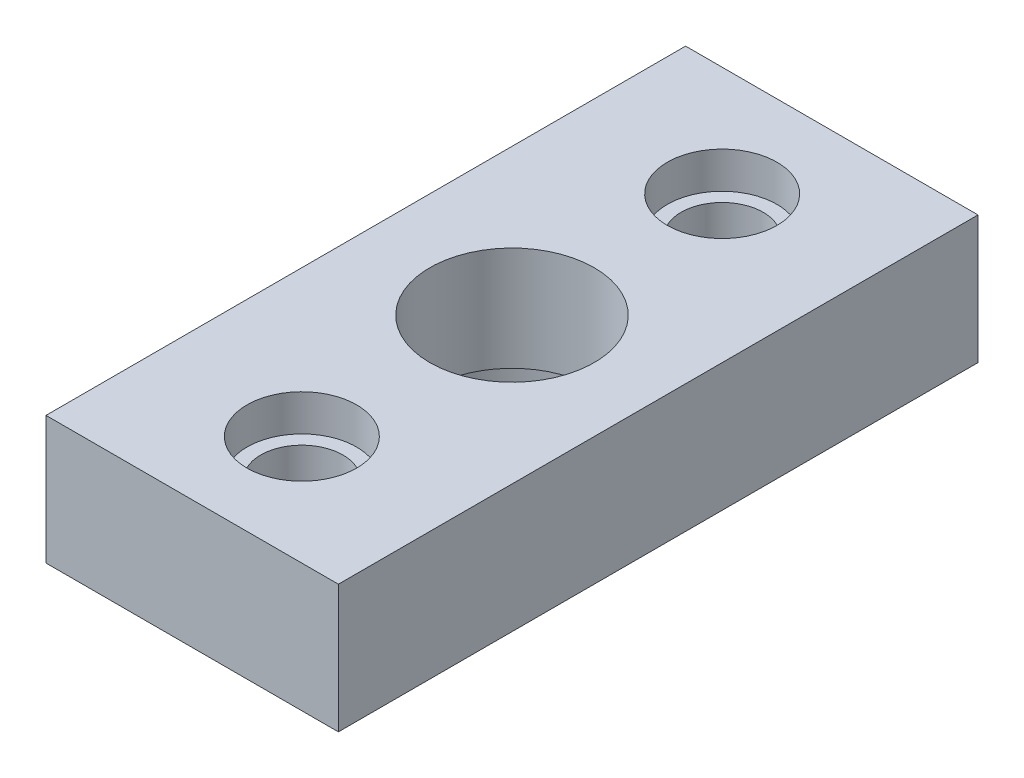
ISO-10303-21;
HEADER;
FILE_DESCRIPTION(('STEP AP214'),'2;1');
FILE_NAME('part.step','',(''),(''),'','','');
FILE_SCHEMA(('AUTOMOTIVE_DESIGN { 1 0 10303 214 1 1 1 1 }'));
ENDSEC;
DATA;
#1=APPLICATION_CONTEXT('core data for automotive mechanical design processes');
#2=APPLICATION_PROTOCOL_DEFINITION('international standard','automotive_design',2000,#1);
#3=PRODUCT_CONTEXT('',#1,'mechanical');
#4=PRODUCT('Part','Part','',(#3));
#5=PRODUCT_RELATED_PRODUCT_CATEGORY('part','',(#4));
#6=PRODUCT_DEFINITION_FORMATION('','',#4);
#7=PRODUCT_DEFINITION_CONTEXT('part definition',#1,'design');
#8=PRODUCT_DEFINITION('design','',#6,#7);
#9=PRODUCT_DEFINITION_SHAPE('','',#8);
#10=(LENGTH_UNIT() NAMED_UNIT(*) SI_UNIT(.MILLI.,.METRE.));
#11=(NAMED_UNIT(*) PLANE_ANGLE_UNIT() SI_UNIT($,.RADIAN.));
#12=(NAMED_UNIT(*) SI_UNIT($,.STERADIAN.) SOLID_ANGLE_UNIT());
#13=UNCERTAINTY_MEASURE_WITH_UNIT(LENGTH_MEASURE(1.E-05),#10,'distance_accuracy_value','');
#14=(GEOMETRIC_REPRESENTATION_CONTEXT(3) GLOBAL_UNCERTAINTY_ASSIGNED_CONTEXT((#13)) GLOBAL_UNIT_ASSIGNED_CONTEXT((#10,
#11,#12)) REPRESENTATION_CONTEXT('',''));
#15=CARTESIAN_POINT('',(0.,0.,0.));
#16=DIRECTION('',(0.,0.,1.));
#17=DIRECTION('',(1.,0.,0.));
#18=AXIS2_PLACEMENT_3D('',#15,#16,#17);
#19=CARTESIAN_POINT('',(8.,7.,17.5));
#20=DIRECTION('',(-1.,0.,0.));
#21=DIRECTION('',(0.,0.,1.));
#22=AXIS2_PLACEMENT_3D('',#19,#20,#21);
#23=PLANE('',#22);
#24=DIRECTION('',(0.,0.,-1.));
#25=VECTOR('',#24,1.);
#26=CARTESIAN_POINT('',(8.,0.,17.5));
#27=LINE('',#26,#25);
#28=CARTESIAN_POINT('',(8.,0.,17.5));
#29=VERTEX_POINT('',#28);
#30=CARTESIAN_POINT('',(8.,0.,-17.5));
#31=VERTEX_POINT('',#30);
#32=EDGE_CURVE('E96',#29,#31,#27,.T.);
#33=ORIENTED_EDGE('',*,*,#32,.T.);
#34=DIRECTION('',(0.,-1.,0.));
#35=VECTOR('',#34,1.);
#36=CARTESIAN_POINT('',(8.,7.,-17.5));
#37=LINE('',#36,#35);
#38=CARTESIAN_POINT('',(8.,7.,-17.5));
#39=VERTEX_POINT('',#38);
#40=EDGE_CURVE('E11',#39,#31,#37,.T.);
#41=ORIENTED_EDGE('',*,*,#40,.F.);
#42=DIRECTION('',(0.,0.,-1.));
#43=VECTOR('',#42,1.);
#44=CARTESIAN_POINT('',(8.,7.,17.5));
#45=LINE('',#44,#43);
#46=CARTESIAN_POINT('',(8.,7.,17.5));
#47=VERTEX_POINT('',#46);
#48=EDGE_CURVE('E84',#47,#39,#45,.T.);
#49=ORIENTED_EDGE('',*,*,#48,.F.);
#50=DIRECTION('',(0.,-1.,0.));
#51=VECTOR('',#50,1.);
#52=CARTESIAN_POINT('',(8.,7.,17.5));
#53=LINE('',#52,#51);
#54=EDGE_CURVE('E92',#47,#29,#53,.T.);
#55=ORIENTED_EDGE('',*,*,#54,.T.);
#56=EDGE_LOOP('',(#33,#41,#49,#55));
#57=FACE_BOUND('',#56,.T.);
#58=ADVANCED_FACE('F33',(#57),#23,.F.);
#59=CARTESIAN_POINT('',(-8.,7.,-17.5));
#60=DIRECTION('',(0.,0.,1.));
#61=DIRECTION('',(1.,0.,0.));
#62=AXIS2_PLACEMENT_3D('',#59,#60,#61);
#63=PLANE('',#62);
#64=DIRECTION('',(-1.,0.,0.));
#65=VECTOR('',#64,1.);
#66=CARTESIAN_POINT('',(-8.,0.,-17.5));
#67=LINE('',#66,#65);
#68=CARTESIAN_POINT('',(-8.,0.,-17.5));
#69=VERTEX_POINT('',#68);
#70=EDGE_CURVE('E88',#31,#69,#67,.T.);
#71=ORIENTED_EDGE('',*,*,#70,.T.);
#72=DIRECTION('',(0.,-1.,0.));
#73=VECTOR('',#72,1.);
#74=CARTESIAN_POINT('',(-8.,7.,-17.5));
#75=LINE('',#74,#73);
#76=CARTESIAN_POINT('',(-8.,7.,-17.5));
#77=VERTEX_POINT('',#76);
#78=EDGE_CURVE('E41',#77,#69,#75,.T.);
#79=ORIENTED_EDGE('',*,*,#78,.F.);
#80=DIRECTION('',(-1.,0.,0.));
#81=VECTOR('',#80,1.);
#82=CARTESIAN_POINT('',(-8.,7.,-17.5));
#83=LINE('',#82,#81);
#84=EDGE_CURVE('E79',#39,#77,#83,.T.);
#85=ORIENTED_EDGE('',*,*,#84,.F.);
#86=ORIENTED_EDGE('',*,*,#40,.T.);
#87=EDGE_LOOP('',(#71,#79,#85,#86));
#88=FACE_BOUND('',#87,.T.);
#89=ADVANCED_FACE('F87',(#88),#63,.F.);
#90=CARTESIAN_POINT('',(-8.,7.,17.5));
#91=DIRECTION('',(1.,0.,0.));
#92=DIRECTION('',(0.,0.,-1.));
#93=AXIS2_PLACEMENT_3D('',#90,#91,#92);
#94=PLANE('',#93);
#95=DIRECTION('',(0.,0.,1.));
#96=VECTOR('',#95,1.);
#97=CARTESIAN_POINT('',(-8.,0.,17.5));
#98=LINE('',#97,#96);
#99=CARTESIAN_POINT('',(-8.,0.,17.5));
#100=VERTEX_POINT('',#99);
#101=EDGE_CURVE('E66',#69,#100,#98,.T.);
#102=ORIENTED_EDGE('',*,*,#101,.T.);
#103=DIRECTION('',(0.,-1.,0.));
#104=VECTOR('',#103,1.);
#105=CARTESIAN_POINT('',(-8.,7.,17.5));
#106=LINE('',#105,#104);
#107=CARTESIAN_POINT('',(-8.,7.,17.5));
#108=VERTEX_POINT('',#107);
#109=EDGE_CURVE('E89',#108,#100,#106,.T.);
#110=ORIENTED_EDGE('',*,*,#109,.F.);
#111=DIRECTION('',(0.,0.,1.));
#112=VECTOR('',#111,1.);
#113=CARTESIAN_POINT('',(-8.,7.,17.5));
#114=LINE('',#113,#112);
#115=EDGE_CURVE('E82',#77,#108,#114,.T.);
#116=ORIENTED_EDGE('',*,*,#115,.F.);
#117=ORIENTED_EDGE('',*,*,#78,.T.);
#118=EDGE_LOOP('',(#102,#110,#116,#117));
#119=FACE_BOUND('',#118,.T.);
#120=ADVANCED_FACE('F90',(#119),#94,.F.);
#121=CARTESIAN_POINT('',(-8.,7.,17.5));
#122=DIRECTION('',(0.,0.,-1.));
#123=DIRECTION('',(-1.,0.,0.));
#124=AXIS2_PLACEMENT_3D('',#121,#122,#123);
#125=PLANE('',#124);
#126=DIRECTION('',(1.,0.,0.));
#127=VECTOR('',#126,1.);
#128=CARTESIAN_POINT('',(-8.,0.,17.5));
#129=LINE('',#128,#127);
#130=EDGE_CURVE('E72',#100,#29,#129,.T.);
#131=ORIENTED_EDGE('',*,*,#130,.T.);
#132=ORIENTED_EDGE('',*,*,#54,.F.);
#133=DIRECTION('',(1.,0.,0.));
#134=VECTOR('',#133,1.);
#135=CARTESIAN_POINT('',(-8.,7.,17.5));
#136=LINE('',#135,#134);
#137=EDGE_CURVE('E49',#108,#47,#136,.T.);
#138=ORIENTED_EDGE('',*,*,#137,.F.);
#139=ORIENTED_EDGE('',*,*,#109,.T.);
#140=EDGE_LOOP('',(#131,#132,#138,#139));
#141=FACE_BOUND('',#140,.T.);
#142=ADVANCED_FACE('F104',(#141),#125,.F.);
#143=CARTESIAN_POINT('',(0.,7.,0.));
#144=DIRECTION('',(0.,-1.,0.));
#145=DIRECTION('',(0.,0.,-1.));
#146=AXIS2_PLACEMENT_3D('',#143,#144,#145);
#147=PLANE('',#146);
#148=CARTESIAN_POINT('',(0.,7.,11.5));
#149=DIRECTION('',(0.,1.,0.));
#150=DIRECTION('',(0.,0.,1.));
#151=AXIS2_PLACEMENT_3D('',#148,#149,#150);
#152=CIRCLE('',#151,3.);
#153=CARTESIAN_POINT('',(0.,7.,14.5));
#154=VERTEX_POINT('',#153);
#155=EDGE_CURVE('E128',#154,#154,#152,.T.);
#156=ORIENTED_EDGE('',*,*,#155,.F.);
#157=EDGE_LOOP('',(#156));
#158=FACE_BOUND('',#157,.T.);
#159=CARTESIAN_POINT('',(0.,7.,-11.5));
#160=DIRECTION('',(0.,1.,0.));
#161=DIRECTION('',(0.,0.,1.));
#162=AXIS2_PLACEMENT_3D('',#159,#160,#161);
#163=CIRCLE('',#162,3.);
#164=CARTESIAN_POINT('',(0.,7.,-8.5));
#165=VERTEX_POINT('',#164);
#166=EDGE_CURVE('E122',#165,#165,#163,.T.);
#167=ORIENTED_EDGE('',*,*,#166,.F.);
#168=EDGE_LOOP('',(#167));
#169=FACE_BOUND('',#168,.T.);
#170=CARTESIAN_POINT('',(0.,7.,0.));
#171=DIRECTION('',(0.,-1.,0.));
#172=DIRECTION('',(0.,0.,-1.));
#173=AXIS2_PLACEMENT_3D('',#170,#171,#172);
#174=CIRCLE('',#173,4.5);
#175=CARTESIAN_POINT('',(0.,7.,-4.5));
#176=VERTEX_POINT('',#175);
#177=EDGE_CURVE('E113',#176,#176,#174,.T.);
#178=ORIENTED_EDGE('',*,*,#177,.T.);
#179=EDGE_LOOP('',(#178));
#180=FACE_BOUND('',#179,.T.);
#181=ORIENTED_EDGE('',*,*,#48,.T.);
#182=ORIENTED_EDGE('',*,*,#84,.T.);
#183=ORIENTED_EDGE('',*,*,#115,.T.);
#184=ORIENTED_EDGE('',*,*,#137,.T.);
#185=EDGE_LOOP('',(#181,#182,#183,#184));
#186=FACE_BOUND('',#185,.T.);
#187=ADVANCED_FACE('F80',(#158,#169,#180,#186),#147,.F.);
#188=CARTESIAN_POINT('',(0.,0.,0.));
#189=DIRECTION('',(0.,-1.,0.));
#190=DIRECTION('',(0.,0.,-1.));
#191=AXIS2_PLACEMENT_3D('',#188,#189,#190);
#192=PLANE('',#191);
#193=CARTESIAN_POINT('',(0.,0.,-11.5));
#194=DIRECTION('',(0.,1.,0.));
#195=DIRECTION('',(0.,0.,1.));
#196=AXIS2_PLACEMENT_3D('',#193,#194,#195);
#197=CIRCLE('',#196,2.25);
#198=CARTESIAN_POINT('',(0.,0.,-9.25000000000001));
#199=VERTEX_POINT('',#198);
#200=EDGE_CURVE('E137',#199,#199,#197,.T.);
#201=ORIENTED_EDGE('',*,*,#200,.T.);
#202=EDGE_LOOP('',(#201));
#203=FACE_BOUND('',#202,.T.);
#204=CARTESIAN_POINT('',(0.,0.,11.5));
#205=DIRECTION('',(0.,1.,0.));
#206=DIRECTION('',(0.,0.,1.));
#207=AXIS2_PLACEMENT_3D('',#204,#205,#206);
#208=CIRCLE('',#207,2.25);
#209=CARTESIAN_POINT('',(0.,0.,13.75));
#210=VERTEX_POINT('',#209);
#211=EDGE_CURVE('E131',#210,#210,#208,.T.);
#212=ORIENTED_EDGE('',*,*,#211,.T.);
#213=EDGE_LOOP('',(#212));
#214=FACE_BOUND('',#213,.T.);
#215=CARTESIAN_POINT('',(0.,0.,0.));
#216=DIRECTION('',(0.,-1.,0.));
#217=DIRECTION('',(0.,0.,-1.));
#218=AXIS2_PLACEMENT_3D('',#215,#216,#217);
#219=CIRCLE('',#218,5.35);
#220=CARTESIAN_POINT('',(0.,0.,-5.35));
#221=VERTEX_POINT('',#220);
#222=EDGE_CURVE('E110',#221,#221,#219,.T.);
#223=ORIENTED_EDGE('',*,*,#222,.F.);
#224=EDGE_LOOP('',(#223));
#225=FACE_BOUND('',#224,.T.);
#226=ORIENTED_EDGE('',*,*,#32,.F.);
#227=ORIENTED_EDGE('',*,*,#130,.F.);
#228=ORIENTED_EDGE('',*,*,#101,.F.);
#229=ORIENTED_EDGE('',*,*,#70,.F.);
#230=EDGE_LOOP('',(#226,#227,#228,#229));
#231=FACE_BOUND('',#230,.T.);
#232=ADVANCED_FACE('F107',(#203,#214,#225,#231),#192,.T.);
#233=CARTESIAN_POINT('',(0.,1.3,0.));
#234=DIRECTION('',(0.,-1.,0.));
#235=DIRECTION('',(0.,0.,-1.));
#236=AXIS2_PLACEMENT_3D('',#233,#234,#235);
#237=CYLINDRICAL_SURFACE('',#236,5.35);
#238=CARTESIAN_POINT('',(0.,1.3,0.));
#239=DIRECTION('',(0.,-1.,0.));
#240=DIRECTION('',(0.,0.,-1.));
#241=AXIS2_PLACEMENT_3D('',#238,#239,#240);
#242=CIRCLE('',#241,5.35);
#243=CARTESIAN_POINT('',(0.,1.3,-5.35));
#244=VERTEX_POINT('',#243);
#245=EDGE_CURVE('E99',#244,#244,#242,.T.);
#246=ORIENTED_EDGE('',*,*,#245,.F.);
#247=EDGE_LOOP('',(#246));
#248=FACE_BOUND('',#247,.T.);
#249=ORIENTED_EDGE('',*,*,#222,.T.);
#250=EDGE_LOOP('',(#249));
#251=FACE_BOUND('',#250,.T.);
#252=ADVANCED_FACE('F183',(#248,#251),#237,.F.);
#253=CARTESIAN_POINT('',(0.,1.3,0.));
#254=DIRECTION('',(0.,-1.,0.));
#255=DIRECTION('',(0.,0.,-1.));
#256=AXIS2_PLACEMENT_3D('',#253,#254,#255);
#257=PLANE('',#256);
#258=CARTESIAN_POINT('',(0.,1.3,0.));
#259=DIRECTION('',(0.,-1.,0.));
#260=DIRECTION('',(0.,0.,-1.));
#261=AXIS2_PLACEMENT_3D('',#258,#259,#260);
#262=CIRCLE('',#261,4.5);
#263=CARTESIAN_POINT('',(0.,1.3,-4.5));
#264=VERTEX_POINT('',#263);
#265=EDGE_CURVE('E116',#264,#264,#262,.T.);
#266=ORIENTED_EDGE('',*,*,#265,.F.);
#267=EDGE_LOOP('',(#266));
#268=FACE_BOUND('',#267,.T.);
#269=ORIENTED_EDGE('',*,*,#245,.T.);
#270=EDGE_LOOP('',(#269));
#271=FACE_BOUND('',#270,.T.);
#272=ADVANCED_FACE('F177',(#268,#271),#257,.T.);
#273=CARTESIAN_POINT('',(0.,7.,0.));
#274=DIRECTION('',(0.,-1.,0.));
#275=DIRECTION('',(0.,0.,-1.));
#276=AXIS2_PLACEMENT_3D('',#273,#274,#275);
#277=CYLINDRICAL_SURFACE('',#276,4.5);
#278=ORIENTED_EDGE('',*,*,#177,.F.);
#279=EDGE_LOOP('',(#278));
#280=FACE_BOUND('',#279,.T.);
#281=ORIENTED_EDGE('',*,*,#265,.T.);
#282=EDGE_LOOP('',(#281));
#283=FACE_BOUND('',#282,.T.);
#284=ADVANCED_FACE('F165',(#280,#283),#277,.F.);
#285=CARTESIAN_POINT('',(0.,5.,-11.5));
#286=DIRECTION('',(0.,1.,0.));
#287=DIRECTION('',(0.,0.,1.));
#288=AXIS2_PLACEMENT_3D('',#285,#286,#287);
#289=CYLINDRICAL_SURFACE('',#288,3.);
#290=CARTESIAN_POINT('',(0.,5.,-11.5));
#291=DIRECTION('',(0.,1.,0.));
#292=DIRECTION('',(0.,0.,1.));
#293=AXIS2_PLACEMENT_3D('',#290,#291,#292);
#294=CIRCLE('',#293,3.);
#295=CARTESIAN_POINT('',(0.,5.,-8.5));
#296=VERTEX_POINT('',#295);
#297=EDGE_CURVE('E119',#296,#296,#294,.T.);
#298=ORIENTED_EDGE('',*,*,#297,.F.);
#299=EDGE_LOOP('',(#298));
#300=FACE_BOUND('',#299,.T.);
#301=ORIENTED_EDGE('',*,*,#166,.T.);
#302=EDGE_LOOP('',(#301));
#303=FACE_BOUND('',#302,.T.);
#304=ADVANCED_FACE('F159',(#300,#303),#289,.F.);
#305=CARTESIAN_POINT('',(0.,5.,-11.5));
#306=DIRECTION('',(0.,1.,0.));
#307=DIRECTION('',(0.,0.,1.));
#308=AXIS2_PLACEMENT_3D('',#305,#306,#307);
#309=PLANE('',#308);
#310=CARTESIAN_POINT('',(0.,5.,-11.5));
#311=DIRECTION('',(0.,1.,0.));
#312=DIRECTION('',(0.,0.,1.));
#313=AXIS2_PLACEMENT_3D('',#310,#311,#312);
#314=CIRCLE('',#313,2.25);
#315=CARTESIAN_POINT('',(0.,5.,-9.25000000000001));
#316=VERTEX_POINT('',#315);
#317=EDGE_CURVE('E140',#316,#316,#314,.T.);
#318=ORIENTED_EDGE('',*,*,#317,.F.);
#319=EDGE_LOOP('',(#318));
#320=FACE_BOUND('',#319,.T.);
#321=ORIENTED_EDGE('',*,*,#297,.T.);
#322=EDGE_LOOP('',(#321));
#323=FACE_BOUND('',#322,.T.);
#324=ADVANCED_FACE('F155',(#320,#323),#309,.T.);
#325=CARTESIAN_POINT('',(0.,5.,11.5));
#326=DIRECTION('',(0.,1.,0.));
#327=DIRECTION('',(0.,0.,1.));
#328=AXIS2_PLACEMENT_3D('',#325,#326,#327);
#329=CYLINDRICAL_SURFACE('',#328,3.);
#330=CARTESIAN_POINT('',(0.,5.,11.5));
#331=DIRECTION('',(0.,1.,0.));
#332=DIRECTION('',(0.,0.,1.));
#333=AXIS2_PLACEMENT_3D('',#330,#331,#332);
#334=CIRCLE('',#333,3.);
#335=CARTESIAN_POINT('',(0.,5.,14.5));
#336=VERTEX_POINT('',#335);
#337=EDGE_CURVE('E125',#336,#336,#334,.T.);
#338=ORIENTED_EDGE('',*,*,#337,.F.);
#339=EDGE_LOOP('',(#338));
#340=FACE_BOUND('',#339,.T.);
#341=ORIENTED_EDGE('',*,*,#155,.T.);
#342=EDGE_LOOP('',(#341));
#343=FACE_BOUND('',#342,.T.);
#344=ADVANCED_FACE('F158',(#340,#343),#329,.F.);
#345=CARTESIAN_POINT('',(0.,5.,11.5));
#346=DIRECTION('',(0.,1.,0.));
#347=DIRECTION('',(0.,0.,1.));
#348=AXIS2_PLACEMENT_3D('',#345,#346,#347);
#349=PLANE('',#348);
#350=CARTESIAN_POINT('',(0.,5.,11.5));
#351=DIRECTION('',(0.,1.,0.));
#352=DIRECTION('',(0.,0.,1.));
#353=AXIS2_PLACEMENT_3D('',#350,#351,#352);
#354=CIRCLE('',#353,2.25);
#355=CARTESIAN_POINT('',(0.,5.,13.75));
#356=VERTEX_POINT('',#355);
#357=EDGE_CURVE('E134',#356,#356,#354,.T.);
#358=ORIENTED_EDGE('',*,*,#357,.F.);
#359=EDGE_LOOP('',(#358));
#360=FACE_BOUND('',#359,.T.);
#361=ORIENTED_EDGE('',*,*,#337,.T.);
#362=EDGE_LOOP('',(#361));
#363=FACE_BOUND('',#362,.T.);
#364=ADVANCED_FACE('F235',(#360,#363),#349,.T.);
#365=CARTESIAN_POINT('',(0.,0.,11.5));
#366=DIRECTION('',(0.,1.,0.));
#367=DIRECTION('',(0.,0.,1.));
#368=AXIS2_PLACEMENT_3D('',#365,#366,#367);
#369=CYLINDRICAL_SURFACE('',#368,2.25);
#370=ORIENTED_EDGE('',*,*,#211,.F.);
#371=EDGE_LOOP('',(#370));
#372=FACE_BOUND('',#371,.T.);
#373=ORIENTED_EDGE('',*,*,#357,.T.);
#374=EDGE_LOOP('',(#373));
#375=FACE_BOUND('',#374,.T.);
#376=ADVANCED_FACE('F151',(#372,#375),#369,.F.);
#377=CARTESIAN_POINT('',(0.,0.,-11.5));
#378=DIRECTION('',(0.,1.,0.));
#379=DIRECTION('',(0.,0.,1.));
#380=AXIS2_PLACEMENT_3D('',#377,#378,#379);
#381=CYLINDRICAL_SURFACE('',#380,2.25);
#382=ORIENTED_EDGE('',*,*,#200,.F.);
#383=EDGE_LOOP('',(#382));
#384=FACE_BOUND('',#383,.T.);
#385=ORIENTED_EDGE('',*,*,#317,.T.);
#386=EDGE_LOOP('',(#385));
#387=FACE_BOUND('',#386,.T.);
#388=ADVANCED_FACE('F148',(#384,#387),#381,.F.);
#389=CLOSED_SHELL('',(#58,#89,#120,#142,#187,#232,#252,#272,#284,#304,#324,#344,#364,#376,#388));
#390=MANIFOLD_SOLID_BREP('B2',#389);
#391=ADVANCED_BREP_SHAPE_REPRESENTATION('',(#18,#390),#14);
#392=SHAPE_DEFINITION_REPRESENTATION(#9,#391);
ENDSEC;
END-ISO-10303-21;
